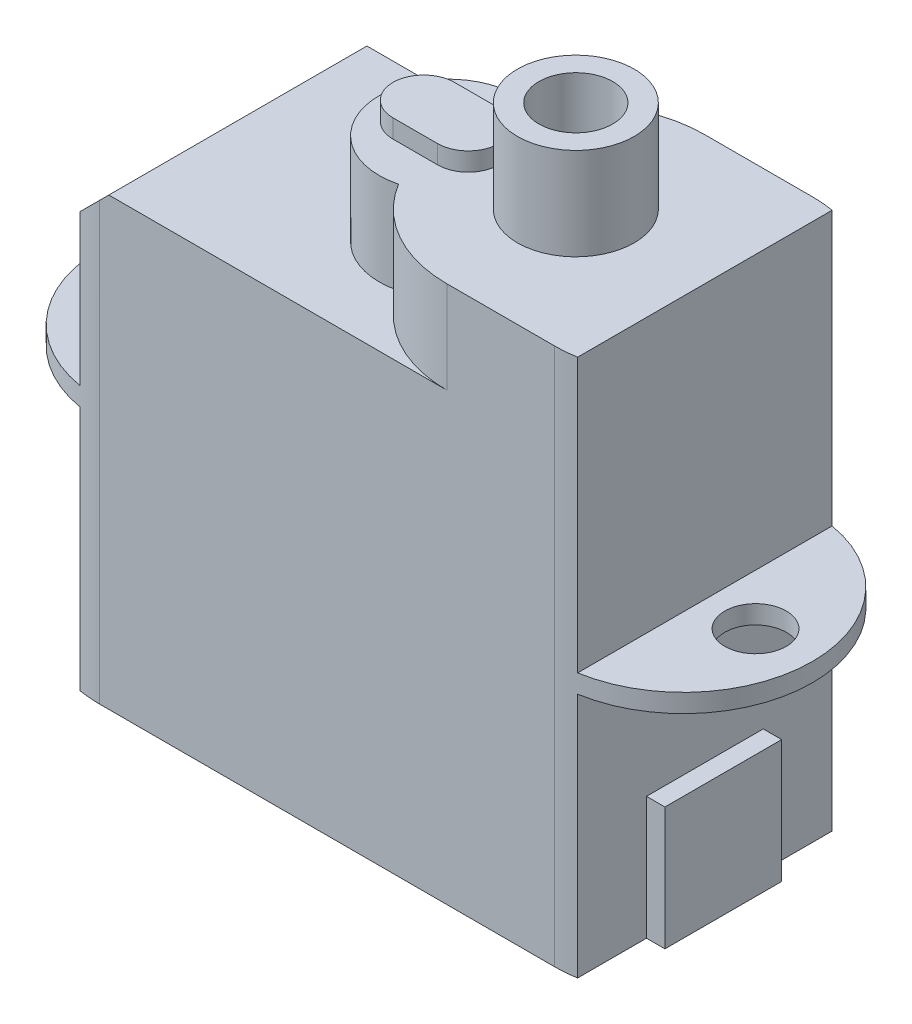
ISO-10303-21;
HEADER;
FILE_DESCRIPTION(('STEP AP214'),'2;1');
FILE_NAME('part.step','',(''),(''),'','','');
FILE_SCHEMA(('AUTOMOTIVE_DESIGN { 1 0 10303 214 1 1 1 1 }'));
ENDSEC;
DATA;
#1=APPLICATION_CONTEXT('core data for automotive mechanical design processes');
#2=APPLICATION_PROTOCOL_DEFINITION('international standard','automotive_design',2000,#1);
#3=PRODUCT_CONTEXT('',#1,'mechanical');
#4=PRODUCT('Part','Part','',(#3));
#5=PRODUCT_RELATED_PRODUCT_CATEGORY('part','',(#4));
#6=PRODUCT_DEFINITION_FORMATION('','',#4);
#7=PRODUCT_DEFINITION_CONTEXT('part definition',#1,'design');
#8=PRODUCT_DEFINITION('design','',#6,#7);
#9=PRODUCT_DEFINITION_SHAPE('','',#8);
#10=(LENGTH_UNIT() NAMED_UNIT(*) SI_UNIT(.MILLI.,.METRE.));
#11=(NAMED_UNIT(*) PLANE_ANGLE_UNIT() SI_UNIT($,.RADIAN.));
#12=(NAMED_UNIT(*) SI_UNIT($,.STERADIAN.) SOLID_ANGLE_UNIT());
#13=UNCERTAINTY_MEASURE_WITH_UNIT(LENGTH_MEASURE(1.E-05),#10,'distance_accuracy_value','');
#14=(GEOMETRIC_REPRESENTATION_CONTEXT(3) GLOBAL_UNCERTAINTY_ASSIGNED_CONTEXT((#13)) GLOBAL_UNIT_ASSIGNED_CONTEXT((#10,
#11,#12)) REPRESENTATION_CONTEXT('',''));
#15=CARTESIAN_POINT('',(0.,0.,0.));
#16=DIRECTION('',(0.,0.,1.));
#17=DIRECTION('',(1.,0.,0.));
#18=AXIS2_PLACEMENT_3D('',#15,#16,#17);
#19=CARTESIAN_POINT('',(8.1,14.5,4.2));
#20=DIRECTION('',(-1.,0.,0.));
#21=DIRECTION('',(0.,0.,1.));
#22=AXIS2_PLACEMENT_3D('',#19,#20,#21);
#23=PLANE('',#22);
#24=DIRECTION('',(0.,-1.,0.));
#25=VECTOR('',#24,1.);
#26=CARTESIAN_POINT('',(8.1,0.,1.9));
#27=LINE('',#26,#25);
#28=CARTESIAN_POINT('',(8.1,4.,1.9));
#29=VERTEX_POINT('',#28);
#30=CARTESIAN_POINT('',(8.1,0.,1.9));
#31=VERTEX_POINT('',#30);
#32=EDGE_CURVE('E272',#29,#31,#27,.T.);
#33=ORIENTED_EDGE('',*,*,#32,.F.);
#34=DIRECTION('',(0.,0.,1.));
#35=VECTOR('',#34,1.);
#36=CARTESIAN_POINT('',(8.1,4.,1.9));
#37=LINE('',#36,#35);
#38=CARTESIAN_POINT('',(8.1,4.,-1.9));
#39=VERTEX_POINT('',#38);
#40=EDGE_CURVE('E285',#39,#29,#37,.T.);
#41=ORIENTED_EDGE('',*,*,#40,.F.);
#42=DIRECTION('',(0.,1.,0.));
#43=VECTOR('',#42,1.);
#44=CARTESIAN_POINT('',(8.1,0.,-1.9));
#45=LINE('',#44,#43);
#46=CARTESIAN_POINT('',(8.1,0.,-1.9));
#47=VERTEX_POINT('',#46);
#48=EDGE_CURVE('E276',#47,#39,#45,.T.);
#49=ORIENTED_EDGE('',*,*,#48,.F.);
#50=DIRECTION('',(0.,0.,-1.));
#51=VECTOR('',#50,1.);
#52=CARTESIAN_POINT('',(8.1,0.,4.2));
#53=LINE('',#52,#51);
#54=CARTESIAN_POINT('',(8.1,0.,-4.14125584816973));
#55=VERTEX_POINT('',#54);
#56=EDGE_CURVE('E403',#47,#55,#53,.T.);
#57=ORIENTED_EDGE('',*,*,#56,.T.);
#58=DIRECTION('',(0.,-1.,0.));
#59=VECTOR('',#58,1.);
#60=CARTESIAN_POINT('',(8.1,7.4,-4.14125584816973));
#61=LINE('',#60,#59);
#62=CARTESIAN_POINT('',(8.1,8.,-4.14125584816973));
#63=VERTEX_POINT('',#62);
#64=EDGE_CURVE('E456',#55,#63,#61,.F.);
#65=ORIENTED_EDGE('',*,*,#64,.T.);
#66=DIRECTION('',(0.,0.,1.));
#67=VECTOR('',#66,1.);
#68=CARTESIAN_POINT('',(8.1,8.,4.2));
#69=LINE('',#68,#67);
#70=CARTESIAN_POINT('',(8.1,8.,4.14125584816973));
#71=VERTEX_POINT('',#70);
#72=EDGE_CURVE('E352',#63,#71,#69,.T.);
#73=ORIENTED_EDGE('',*,*,#72,.T.);
#74=DIRECTION('',(0.,-1.,0.));
#75=VECTOR('',#74,1.);
#76=CARTESIAN_POINT('',(8.1,7.4,4.14125584816973));
#77=LINE('',#76,#75);
#78=CARTESIAN_POINT('',(8.1,0.,4.14125584816973));
#79=VERTEX_POINT('',#78);
#80=EDGE_CURVE('E454',#71,#79,#77,.T.);
#81=ORIENTED_EDGE('',*,*,#80,.T.);
#82=EDGE_CURVE('E411',#79,#31,#53,.T.);
#83=ORIENTED_EDGE('',*,*,#82,.T.);
#84=EDGE_LOOP('',(#33,#41,#49,#57,#65,#73,#81,#83));
#85=FACE_BOUND('',#84,.T.);
#86=ADVANCED_FACE('F70',(#85),#23,.F.);
#87=CARTESIAN_POINT('',(3.9,17.5,0.));
#88=DIRECTION('',(0.,1.,0.));
#89=DIRECTION('',(0.,0.,1.));
#90=AXIS2_PLACEMENT_3D('',#87,#88,#89);
#91=PLANE('',#90);
#92=DIRECTION('',(-1.,0.,0.));
#93=VECTOR('',#92,1.);
#94=CARTESIAN_POINT('',(8.1,17.5,4.2));
#95=LINE('',#94,#93);
#96=CARTESIAN_POINT('',(7.4,17.5,4.2));
#97=VERTEX_POINT('',#96);
#98=CARTESIAN_POINT('',(3.9,17.5,4.2));
#99=VERTEX_POINT('',#98);
#100=EDGE_CURVE('E376',#97,#99,#95,.T.);
#101=ORIENTED_EDGE('',*,*,#100,.F.);
#102=CARTESIAN_POINT('',(7.4,17.5,0.));
#103=DIRECTION('',(0.,1.,0.));
#104=DIRECTION('',(0.,0.,1.));
#105=AXIS2_PLACEMENT_3D('',#102,#103,#104);
#106=CIRCLE('',#105,4.2);
#107=CARTESIAN_POINT('',(8.1,17.5,4.14125584816973));
#108=VERTEX_POINT('',#107);
#109=EDGE_CURVE('E431',#97,#108,#106,.T.);
#110=ORIENTED_EDGE('',*,*,#109,.T.);
#111=DIRECTION('',(0.,0.,1.));
#112=VECTOR('',#111,1.);
#113=CARTESIAN_POINT('',(8.1,17.5,-4.2));
#114=LINE('',#113,#112);
#115=CARTESIAN_POINT('',(8.1,17.5,-4.14125584816973));
#116=VERTEX_POINT('',#115);
#117=EDGE_CURVE('E378',#116,#108,#114,.T.);
#118=ORIENTED_EDGE('',*,*,#117,.F.);
#119=CARTESIAN_POINT('',(7.4,17.5,0.));
#120=DIRECTION('',(0.,1.,0.));
#121=DIRECTION('',(0.,0.,1.));
#122=AXIS2_PLACEMENT_3D('',#119,#120,#121);
#123=CIRCLE('',#122,4.2);
#124=CARTESIAN_POINT('',(7.4,17.5,-4.2));
#125=VERTEX_POINT('',#124);
#126=EDGE_CURVE('E428',#116,#125,#123,.T.);
#127=ORIENTED_EDGE('',*,*,#126,.T.);
#128=DIRECTION('',(1.,0.,0.));
#129=VECTOR('',#128,1.);
#130=CARTESIAN_POINT('',(3.9,17.5,-4.2));
#131=LINE('',#130,#129);
#132=CARTESIAN_POINT('',(3.9,17.5,-4.2));
#133=VERTEX_POINT('',#132);
#134=EDGE_CURVE('E381',#133,#125,#131,.T.);
#135=ORIENTED_EDGE('',*,*,#134,.F.);
#136=CARTESIAN_POINT('',(3.9,17.5,0.));
#137=DIRECTION('',(0.,1.,0.));
#138=DIRECTION('',(0.,0.,1.));
#139=AXIS2_PLACEMENT_3D('',#136,#137,#138);
#140=CIRCLE('',#139,4.2);
#141=CARTESIAN_POINT('',(0.309638554216869,17.5,-2.17928995056511));
#142=VERTEX_POINT('',#141);
#143=EDGE_CURVE('E367',#133,#142,#140,.T.);
#144=ORIENTED_EDGE('',*,*,#143,.T.);
#145=CARTESIAN_POINT('',(-0.249999999999997,17.5,0.));
#146=DIRECTION('',(0.,1.,0.));
#147=DIRECTION('',(0.,0.,1.));
#148=AXIS2_PLACEMENT_3D('',#145,#146,#147);
#149=CIRCLE('',#148,2.25);
#150=CARTESIAN_POINT('',(0.309638554216869,17.5,2.1792899505651));
#151=VERTEX_POINT('',#150);
#152=EDGE_CURVE('E370',#142,#151,#149,.T.);
#153=ORIENTED_EDGE('',*,*,#152,.T.);
#154=CARTESIAN_POINT('',(3.9,17.5,0.));
#155=DIRECTION('',(0.,1.,0.));
#156=DIRECTION('',(0.,0.,1.));
#157=AXIS2_PLACEMENT_3D('',#154,#155,#156);
#158=CIRCLE('',#157,4.2);
#159=EDGE_CURVE('E373',#151,#99,#158,.T.);
#160=ORIENTED_EDGE('',*,*,#159,.T.);
#161=EDGE_LOOP('',(#101,#110,#118,#127,#135,#144,#153,#160));
#162=FACE_BOUND('',#161,.T.);
#163=CARTESIAN_POINT('',(3.9,17.5,0.));
#164=DIRECTION('',(0.,1.,0.));
#165=DIRECTION('',(0.,0.,1.));
#166=AXIS2_PLACEMENT_3D('',#163,#164,#165);
#167=CIRCLE('',#166,1.9);
#168=CARTESIAN_POINT('',(3.9,17.5,1.9));
#169=VERTEX_POINT('',#168);
#170=EDGE_CURVE('E363',#169,#169,#167,.T.);
#171=ORIENTED_EDGE('',*,*,#170,.F.);
#172=EDGE_LOOP('',(#171));
#173=FACE_BOUND('',#172,.T.);
#174=DIRECTION('',(1.,0.,0.));
#175=VECTOR('',#174,1.);
#176=CARTESIAN_POINT('',(-1.05,17.5,1.));
#177=LINE('',#176,#175);
#178=CARTESIAN_POINT('',(-1.05,17.5,1.));
#179=VERTEX_POINT('',#178);
#180=CARTESIAN_POINT('',(0.400000000000003,17.5,1.));
#181=VERTEX_POINT('',#180);
#182=EDGE_CURVE('E321',#179,#181,#177,.T.);
#183=ORIENTED_EDGE('',*,*,#182,.F.);
#184=CARTESIAN_POINT('',(-1.05,17.5,0.));
#185=DIRECTION('',(0.,1.,0.));
#186=DIRECTION('',(0.,0.,1.));
#187=AXIS2_PLACEMENT_3D('',#184,#185,#186);
#188=CIRCLE('',#187,1.);
#189=CARTESIAN_POINT('',(-1.05,17.5,-1.));
#190=VERTEX_POINT('',#189);
#191=EDGE_CURVE('E307',#190,#179,#188,.T.);
#192=ORIENTED_EDGE('',*,*,#191,.F.);
#193=DIRECTION('',(-1.,0.,0.));
#194=VECTOR('',#193,1.);
#195=CARTESIAN_POINT('',(-1.05,17.5,-1.));
#196=LINE('',#195,#194);
#197=CARTESIAN_POINT('',(0.400000000000003,17.5,-1.));
#198=VERTEX_POINT('',#197);
#199=EDGE_CURVE('E312',#198,#190,#196,.T.);
#200=ORIENTED_EDGE('',*,*,#199,.F.);
#201=CARTESIAN_POINT('',(0.400000000000003,17.5,0.));
#202=DIRECTION('',(0.,1.,0.));
#203=DIRECTION('',(0.,0.,1.));
#204=AXIS2_PLACEMENT_3D('',#201,#202,#203);
#205=CIRCLE('',#204,1.);
#206=EDGE_CURVE('E323',#181,#198,#205,.T.);
#207=ORIENTED_EDGE('',*,*,#206,.F.);
#208=EDGE_LOOP('',(#183,#192,#200,#207));
#209=FACE_BOUND('',#208,.T.);
#210=ADVANCED_FACE('F526',(#162,#173,#209),#91,.T.);
#211=CARTESIAN_POINT('',(-7.4,9.2,0.));
#212=DIRECTION('',(0.,-1.,0.));
#213=DIRECTION('',(0.,0.,-1.));
#214=AXIS2_PLACEMENT_3D('',#211,#212,#213);
#215=CYLINDRICAL_SURFACE('',#214,4.2);
#216=DIRECTION('',(0.,-1.,0.));
#217=VECTOR('',#216,1.);
#218=CARTESIAN_POINT('',(-7.4,9.2,4.2));
#219=LINE('',#218,#217);
#220=CARTESIAN_POINT('',(-7.4,14.2,4.2));
#221=VERTEX_POINT('',#220);
#222=CARTESIAN_POINT('',(-7.4,9.2,4.2));
#223=VERTEX_POINT('',#222);
#224=EDGE_CURVE('E461',#221,#223,#219,.T.);
#225=ORIENTED_EDGE('',*,*,#224,.F.);
#226=CARTESIAN_POINT('',(-7.4,14.2,0.));
#227=DIRECTION('',(0.70710678118655,-0.707106781186545,0.));
#228=DIRECTION('',(-0.707106781186545,-0.70710678118655,0.));
#229=AXIS2_PLACEMENT_3D('',#226,#227,#228);
#230=ELLIPSE('',#229,5.93969696196702,4.2);
#231=CARTESIAN_POINT('',(-8.1,13.5,4.14125584816973));
#232=VERTEX_POINT('',#231);
#233=EDGE_CURVE('E500',#221,#232,#230,.T.);
#234=ORIENTED_EDGE('',*,*,#233,.T.);
#235=DIRECTION('',(0.,-1.,0.));
#236=VECTOR('',#235,1.);
#237=CARTESIAN_POINT('',(-8.1,9.2,4.14125584816973));
#238=LINE('',#237,#236);
#239=CARTESIAN_POINT('',(-8.1,8.6,4.14125584816973));
#240=VERTEX_POINT('',#239);
#241=EDGE_CURVE('E488',#240,#232,#238,.F.);
#242=ORIENTED_EDGE('',*,*,#241,.F.);
#243=CARTESIAN_POINT('',(-7.4,8.6,0.));
#244=DIRECTION('',(0.,1.,0.));
#245=DIRECTION('',(0.,0.,1.));
#246=AXIS2_PLACEMENT_3D('',#243,#244,#245);
#247=CIRCLE('',#246,4.2);
#248=CARTESIAN_POINT('',(-8.1,8.6,-4.14125584816973));
#249=VERTEX_POINT('',#248);
#250=EDGE_CURVE('E492',#249,#240,#247,.T.);
#251=ORIENTED_EDGE('',*,*,#250,.F.);
#252=DIRECTION('',(0.,-1.,0.));
#253=VECTOR('',#252,1.);
#254=CARTESIAN_POINT('',(-8.1,9.2,-4.14125584816973));
#255=LINE('',#254,#253);
#256=CARTESIAN_POINT('',(-8.1,13.5,-4.14125584816973));
#257=VERTEX_POINT('',#256);
#258=EDGE_CURVE('E490',#257,#249,#255,.T.);
#259=ORIENTED_EDGE('',*,*,#258,.F.);
#260=CARTESIAN_POINT('',(-7.4,14.2,0.));
#261=DIRECTION('',(0.70710678118655,-0.707106781186545,0.));
#262=DIRECTION('',(-0.707106781186545,-0.70710678118655,0.));
#263=AXIS2_PLACEMENT_3D('',#260,#261,#262);
#264=ELLIPSE('',#263,5.93969696196702,4.2);
#265=CARTESIAN_POINT('',(-7.4,14.2,-4.2));
#266=VERTEX_POINT('',#265);
#267=EDGE_CURVE('E86',#257,#266,#264,.T.);
#268=ORIENTED_EDGE('',*,*,#267,.T.);
#269=DIRECTION('',(0.,-1.,0.));
#270=VECTOR('',#269,1.);
#271=CARTESIAN_POINT('',(-7.4,9.2,-4.2));
#272=LINE('',#271,#270);
#273=CARTESIAN_POINT('',(-7.4,9.2,-4.2));
#274=VERTEX_POINT('',#273);
#275=EDGE_CURVE('E482',#274,#266,#272,.F.);
#276=ORIENTED_EDGE('',*,*,#275,.F.);
#277=DIRECTION('',(0.,-1.,0.));
#278=VECTOR('',#277,1.);
#279=CARTESIAN_POINT('',(-7.4,14.5,-4.2));
#280=LINE('',#279,#278);
#281=CARTESIAN_POINT('',(-7.4,7.4,-4.2));
#282=VERTEX_POINT('',#281);
#283=EDGE_CURVE('E484',#282,#274,#280,.F.);
#284=ORIENTED_EDGE('',*,*,#283,.F.);
#285=DIRECTION('',(0.,-1.,0.));
#286=VECTOR('',#285,1.);
#287=CARTESIAN_POINT('',(-7.4,9.2,-4.2));
#288=LINE('',#287,#286);
#289=CARTESIAN_POINT('',(-7.4,0.,-4.2));
#290=VERTEX_POINT('',#289);
#291=EDGE_CURVE('E486',#290,#282,#288,.F.);
#292=ORIENTED_EDGE('',*,*,#291,.F.);
#293=CARTESIAN_POINT('',(-7.4,0.,0.));
#294=DIRECTION('',(0.,-1.,0.));
#295=DIRECTION('',(0.,0.,-1.));
#296=AXIS2_PLACEMENT_3D('',#293,#294,#295);
#297=CIRCLE('',#296,4.2);
#298=CARTESIAN_POINT('',(-8.1,0.,-4.14125584816973));
#299=VERTEX_POINT('',#298);
#300=EDGE_CURVE('E469',#299,#290,#297,.T.);
#301=ORIENTED_EDGE('',*,*,#300,.F.);
#302=DIRECTION('',(0.,-1.,0.));
#303=VECTOR('',#302,1.);
#304=CARTESIAN_POINT('',(-8.1,9.2,-4.14125584816973));
#305=LINE('',#304,#303);
#306=CARTESIAN_POINT('',(-8.1,8.,-4.14125584816973));
#307=VERTEX_POINT('',#306);
#308=EDGE_CURVE('E475',#307,#299,#305,.T.);
#309=ORIENTED_EDGE('',*,*,#308,.F.);
#310=CARTESIAN_POINT('',(-7.4,8.,0.));
#311=DIRECTION('',(0.,1.,0.));
#312=DIRECTION('',(0.,0.,1.));
#313=AXIS2_PLACEMENT_3D('',#310,#311,#312);
#314=CIRCLE('',#313,4.2);
#315=CARTESIAN_POINT('',(-8.1,8.,4.14125584816973));
#316=VERTEX_POINT('',#315);
#317=EDGE_CURVE('E480',#316,#307,#314,.F.);
#318=ORIENTED_EDGE('',*,*,#317,.F.);
#319=DIRECTION('',(0.,-1.,0.));
#320=VECTOR('',#319,1.);
#321=CARTESIAN_POINT('',(-8.1,9.2,4.14125584816973));
#322=LINE('',#321,#320);
#323=CARTESIAN_POINT('',(-8.1,0.,4.14125584816973));
#324=VERTEX_POINT('',#323);
#325=EDGE_CURVE('E477',#324,#316,#322,.F.);
#326=ORIENTED_EDGE('',*,*,#325,.F.);
#327=CARTESIAN_POINT('',(-7.4,0.,0.));
#328=DIRECTION('',(0.,-1.,0.));
#329=DIRECTION('',(0.,0.,-1.));
#330=AXIS2_PLACEMENT_3D('',#327,#328,#329);
#331=CIRCLE('',#330,4.2);
#332=CARTESIAN_POINT('',(-7.4,0.,4.2));
#333=VERTEX_POINT('',#332);
#334=EDGE_CURVE('E472',#333,#324,#331,.T.);
#335=ORIENTED_EDGE('',*,*,#334,.F.);
#336=DIRECTION('',(0.,-1.,0.));
#337=VECTOR('',#336,1.);
#338=CARTESIAN_POINT('',(-7.4,9.2,4.2));
#339=LINE('',#338,#337);
#340=CARTESIAN_POINT('',(-7.4,7.4,4.2));
#341=VERTEX_POINT('',#340);
#342=EDGE_CURVE('E466',#341,#333,#339,.T.);
#343=ORIENTED_EDGE('',*,*,#342,.F.);
#344=DIRECTION('',(0.,-1.,0.));
#345=VECTOR('',#344,1.);
#346=CARTESIAN_POINT('',(-7.4,14.5,4.2));
#347=LINE('',#346,#345);
#348=EDGE_CURVE('E463',#223,#341,#347,.T.);
#349=ORIENTED_EDGE('',*,*,#348,.F.);
#350=EDGE_LOOP('',(#225,#234,#242,#251,#259,#268,#276,#284,#292,#301,#309,#318,#326,#335,#343,#349));
#351=FACE_BOUND('',#350,.T.);
#352=ADVANCED_FACE('F504',(#351),#215,.T.);
#353=CARTESIAN_POINT('',(7.4,7.4,0.));
#354=DIRECTION('',(0.,-1.,0.));
#355=DIRECTION('',(0.,0.,-1.));
#356=AXIS2_PLACEMENT_3D('',#353,#354,#355);
#357=CYLINDRICAL_SURFACE('',#356,4.2);
#358=DIRECTION('',(0.,-1.,0.));
#359=VECTOR('',#358,1.);
#360=CARTESIAN_POINT('',(7.4,7.4,4.2));
#361=LINE('',#360,#359);
#362=CARTESIAN_POINT('',(7.4,9.2,4.2));
#363=VERTEX_POINT('',#362);
#364=EDGE_CURVE('E425',#363,#97,#361,.F.);
#365=ORIENTED_EDGE('',*,*,#364,.F.);
#366=DIRECTION('',(0.,-1.,0.));
#367=VECTOR('',#366,1.);
#368=CARTESIAN_POINT('',(7.4,14.5,4.2));
#369=LINE('',#368,#367);
#370=CARTESIAN_POINT('',(7.4,7.4,4.2));
#371=VERTEX_POINT('',#370);
#372=EDGE_CURVE('E422',#371,#363,#369,.F.);
#373=ORIENTED_EDGE('',*,*,#372,.F.);
#374=DIRECTION('',(0.,-1.,0.));
#375=VECTOR('',#374,1.);
#376=CARTESIAN_POINT('',(7.4,7.4,4.2));
#377=LINE('',#376,#375);
#378=CARTESIAN_POINT('',(7.4,0.,4.2));
#379=VERTEX_POINT('',#378);
#380=EDGE_CURVE('E410',#379,#371,#377,.F.);
#381=ORIENTED_EDGE('',*,*,#380,.F.);
#382=CARTESIAN_POINT('',(7.4,0.,0.));
#383=DIRECTION('',(0.,-1.,0.));
#384=DIRECTION('',(0.,0.,-1.));
#385=AXIS2_PLACEMENT_3D('',#382,#383,#384);
#386=CIRCLE('',#385,4.2);
#387=EDGE_CURVE('E448',#79,#379,#386,.T.);
#388=ORIENTED_EDGE('',*,*,#387,.F.);
#389=ORIENTED_EDGE('',*,*,#80,.F.);
#390=CARTESIAN_POINT('',(7.4,8.,0.));
#391=DIRECTION('',(0.,-1.,0.));
#392=DIRECTION('',(0.,0.,-1.));
#393=AXIS2_PLACEMENT_3D('',#390,#391,#392);
#394=CIRCLE('',#393,4.2);
#395=EDGE_CURVE('E459',#63,#71,#394,.T.);
#396=ORIENTED_EDGE('',*,*,#395,.F.);
#397=ORIENTED_EDGE('',*,*,#64,.F.);
#398=CARTESIAN_POINT('',(7.4,0.,0.));
#399=DIRECTION('',(0.,-1.,0.));
#400=DIRECTION('',(0.,0.,-1.));
#401=AXIS2_PLACEMENT_3D('',#398,#399,#400);
#402=CIRCLE('',#401,4.2);
#403=CARTESIAN_POINT('',(7.4,0.,-4.2));
#404=VERTEX_POINT('',#403);
#405=EDGE_CURVE('E451',#404,#55,#402,.T.);
#406=ORIENTED_EDGE('',*,*,#405,.F.);
#407=DIRECTION('',(0.,-1.,0.));
#408=VECTOR('',#407,1.);
#409=CARTESIAN_POINT('',(7.4,7.4,-4.2));
#410=LINE('',#409,#408);
#411=CARTESIAN_POINT('',(7.4,7.4,-4.2));
#412=VERTEX_POINT('',#411);
#413=EDGE_CURVE('E441',#412,#404,#410,.T.);
#414=ORIENTED_EDGE('',*,*,#413,.F.);
#415=DIRECTION('',(0.,-1.,0.));
#416=VECTOR('',#415,1.);
#417=CARTESIAN_POINT('',(7.4,14.5,-4.2));
#418=LINE('',#417,#416);
#419=CARTESIAN_POINT('',(7.4,9.2,-4.2));
#420=VERTEX_POINT('',#419);
#421=EDGE_CURVE('E444',#420,#412,#418,.T.);
#422=ORIENTED_EDGE('',*,*,#421,.F.);
#423=DIRECTION('',(0.,-1.,0.));
#424=VECTOR('',#423,1.);
#425=CARTESIAN_POINT('',(7.4,7.4,-4.2));
#426=LINE('',#425,#424);
#427=EDGE_CURVE('E446',#125,#420,#426,.T.);
#428=ORIENTED_EDGE('',*,*,#427,.F.);
#429=ORIENTED_EDGE('',*,*,#126,.F.);
#430=DIRECTION('',(0.,-1.,0.));
#431=VECTOR('',#430,1.);
#432=CARTESIAN_POINT('',(8.1,7.4,-4.14125584816973));
#433=LINE('',#432,#431);
#434=CARTESIAN_POINT('',(8.1,8.6,-4.14125584816973));
#435=VERTEX_POINT('',#434);
#436=EDGE_CURVE('E434',#435,#116,#433,.F.);
#437=ORIENTED_EDGE('',*,*,#436,.F.);
#438=CARTESIAN_POINT('',(7.4,8.6,0.));
#439=DIRECTION('',(0.,-1.,0.));
#440=DIRECTION('',(0.,0.,-1.));
#441=AXIS2_PLACEMENT_3D('',#438,#439,#440);
#442=CIRCLE('',#441,4.2);
#443=CARTESIAN_POINT('',(8.1,8.6,4.14125584816973));
#444=VERTEX_POINT('',#443);
#445=EDGE_CURVE('E439',#444,#435,#442,.F.);
#446=ORIENTED_EDGE('',*,*,#445,.F.);
#447=DIRECTION('',(0.,-1.,0.));
#448=VECTOR('',#447,1.);
#449=CARTESIAN_POINT('',(8.1,7.4,4.14125584816973));
#450=LINE('',#449,#448);
#451=EDGE_CURVE('E436',#108,#444,#450,.T.);
#452=ORIENTED_EDGE('',*,*,#451,.F.);
#453=ORIENTED_EDGE('',*,*,#109,.F.);
#454=EDGE_LOOP('',(#365,#373,#381,#388,#389,#396,#397,#406,#414,#422,#428,#429,#437,#446,#452,#453));
#455=FACE_BOUND('',#454,.T.);
#456=ADVANCED_FACE('F532',(#455),#357,.T.);
#457=CARTESIAN_POINT('',(-8.1,14.5,4.2));
#458=DIRECTION('',(1.,0.,0.));
#459=DIRECTION('',(0.,0.,-1.));
#460=AXIS2_PLACEMENT_3D('',#457,#458,#459);
#461=PLANE('',#460);
#462=ORIENTED_EDGE('',*,*,#241,.T.);
#463=DIRECTION('',(0.,0.,-1.));
#464=VECTOR('',#463,1.);
#465=CARTESIAN_POINT('',(-8.1,13.5,4.2));
#466=LINE('',#465,#464);
#467=EDGE_CURVE('E79',#232,#257,#466,.T.);
#468=ORIENTED_EDGE('',*,*,#467,.T.);
#469=ORIENTED_EDGE('',*,*,#258,.T.);
#470=DIRECTION('',(0.,0.,-1.));
#471=VECTOR('',#470,1.);
#472=CARTESIAN_POINT('',(-8.1,8.6,4.2));
#473=LINE('',#472,#471);
#474=EDGE_CURVE('E343',#240,#249,#473,.T.);
#475=ORIENTED_EDGE('',*,*,#474,.F.);
#476=EDGE_LOOP('',(#462,#468,#469,#475));
#477=FACE_BOUND('',#476,.T.);
#478=ADVANCED_FACE('F509',(#477),#461,.F.);
#479=ORIENTED_EDGE('',*,*,#117,.T.);
#480=ORIENTED_EDGE('',*,*,#451,.T.);
#481=DIRECTION('',(0.,0.,1.));
#482=VECTOR('',#481,1.);
#483=CARTESIAN_POINT('',(8.1,8.6,4.2));
#484=LINE('',#483,#482);
#485=EDGE_CURVE('E355',#435,#444,#484,.T.);
#486=ORIENTED_EDGE('',*,*,#485,.F.);
#487=ORIENTED_EDGE('',*,*,#436,.T.);
#488=EDGE_LOOP('',(#479,#480,#486,#487));
#489=FACE_BOUND('',#488,.T.);
#490=ADVANCED_FACE('F569',(#489),#23,.F.);
#491=CARTESIAN_POINT('',(-8.1,14.5,-4.2));
#492=DIRECTION('',(0.,0.,1.));
#493=DIRECTION('',(1.,0.,0.));
#494=AXIS2_PLACEMENT_3D('',#491,#492,#493);
#495=PLANE('',#494);
#496=ORIENTED_EDGE('',*,*,#275,.T.);
#497=DIRECTION('',(-0.707106781186545,-0.70710678118655,0.));
#498=VECTOR('',#497,1.);
#499=CARTESIAN_POINT('',(-7.1,14.5,-4.2));
#500=LINE('',#499,#498);
#501=CARTESIAN_POINT('',(-7.1,14.5,-4.2));
#502=VERTEX_POINT('',#501);
#503=EDGE_CURVE('E14',#266,#502,#500,.F.);
#504=ORIENTED_EDGE('',*,*,#503,.T.);
#505=DIRECTION('',(-1.,0.,0.));
#506=VECTOR('',#505,1.);
#507=CARTESIAN_POINT('',(-8.1,14.5,-4.2));
#508=LINE('',#507,#506);
#509=CARTESIAN_POINT('',(3.9,14.5,-4.2));
#510=VERTEX_POINT('',#509);
#511=EDGE_CURVE('E404',#510,#502,#508,.T.);
#512=ORIENTED_EDGE('',*,*,#511,.F.);
#513=DIRECTION('',(0.,-1.,0.));
#514=VECTOR('',#513,1.);
#515=CARTESIAN_POINT('',(3.9,17.5,-4.2));
#516=LINE('',#515,#514);
#517=EDGE_CURVE('E384',#133,#510,#516,.T.);
#518=ORIENTED_EDGE('',*,*,#517,.F.);
#519=ORIENTED_EDGE('',*,*,#134,.T.);
#520=ORIENTED_EDGE('',*,*,#427,.T.);
#521=ORIENTED_EDGE('',*,*,#421,.T.);
#522=ORIENTED_EDGE('',*,*,#413,.T.);
#523=DIRECTION('',(-1.,0.,0.));
#524=VECTOR('',#523,1.);
#525=CARTESIAN_POINT('',(-8.1,0.,-4.2));
#526=LINE('',#525,#524);
#527=EDGE_CURVE('E413',#404,#290,#526,.T.);
#528=ORIENTED_EDGE('',*,*,#527,.T.);
#529=ORIENTED_EDGE('',*,*,#291,.T.);
#530=ORIENTED_EDGE('',*,*,#283,.T.);
#531=EDGE_LOOP('',(#496,#504,#512,#518,#519,#520,#521,#522,#528,#529,#530));
#532=FACE_BOUND('',#531,.T.);
#533=ADVANCED_FACE('F514',(#532),#495,.F.);
#534=DIRECTION('',(0.,0.,1.));
#535=VECTOR('',#534,1.);
#536=CARTESIAN_POINT('',(-8.1,0.,4.2));
#537=LINE('',#536,#535);
#538=EDGE_CURVE('E416',#299,#324,#537,.T.);
#539=ORIENTED_EDGE('',*,*,#538,.T.);
#540=ORIENTED_EDGE('',*,*,#325,.T.);
#541=DIRECTION('',(0.,0.,-1.));
#542=VECTOR('',#541,1.);
#543=CARTESIAN_POINT('',(-8.1,8.,4.2));
#544=LINE('',#543,#542);
#545=EDGE_CURVE('E340',#316,#307,#544,.T.);
#546=ORIENTED_EDGE('',*,*,#545,.T.);
#547=ORIENTED_EDGE('',*,*,#308,.T.);
#548=EDGE_LOOP('',(#539,#540,#546,#547));
#549=FACE_BOUND('',#548,.T.);
#550=ADVANCED_FACE('F545',(#549),#461,.F.);
#551=CARTESIAN_POINT('',(-8.1,14.5,4.2));
#552=DIRECTION('',(0.,0.,-1.));
#553=DIRECTION('',(-1.,0.,0.));
#554=AXIS2_PLACEMENT_3D('',#551,#552,#553);
#555=PLANE('',#554);
#556=DIRECTION('',(1.,0.,0.));
#557=VECTOR('',#556,1.);
#558=CARTESIAN_POINT('',(-8.1,14.5,4.2));
#559=LINE('',#558,#557);
#560=CARTESIAN_POINT('',(-7.1,14.5,4.2));
#561=VERTEX_POINT('',#560);
#562=CARTESIAN_POINT('',(3.9,14.5,4.2));
#563=VERTEX_POINT('',#562);
#564=EDGE_CURVE('E407',#561,#563,#559,.T.);
#565=ORIENTED_EDGE('',*,*,#564,.F.);
#566=DIRECTION('',(0.707106781186545,0.70710678118655,0.));
#567=VECTOR('',#566,1.);
#568=CARTESIAN_POINT('',(-7.1,14.5,4.2));
#569=LINE('',#568,#567);
#570=EDGE_CURVE('E497',#561,#221,#569,.F.);
#571=ORIENTED_EDGE('',*,*,#570,.T.);
#572=ORIENTED_EDGE('',*,*,#224,.T.);
#573=ORIENTED_EDGE('',*,*,#348,.T.);
#574=ORIENTED_EDGE('',*,*,#342,.T.);
#575=DIRECTION('',(1.,0.,0.));
#576=VECTOR('',#575,1.);
#577=CARTESIAN_POINT('',(-8.1,0.,4.2));
#578=LINE('',#577,#576);
#579=EDGE_CURVE('E408',#333,#379,#578,.T.);
#580=ORIENTED_EDGE('',*,*,#579,.T.);
#581=ORIENTED_EDGE('',*,*,#380,.T.);
#582=ORIENTED_EDGE('',*,*,#372,.T.);
#583=ORIENTED_EDGE('',*,*,#364,.T.);
#584=ORIENTED_EDGE('',*,*,#100,.T.);
#585=DIRECTION('',(0.,-1.,0.));
#586=VECTOR('',#585,1.);
#587=CARTESIAN_POINT('',(3.9,17.5,4.2));
#588=LINE('',#587,#586);
#589=EDGE_CURVE('E394',#99,#563,#588,.T.);
#590=ORIENTED_EDGE('',*,*,#589,.T.);
#591=EDGE_LOOP('',(#565,#571,#572,#573,#574,#580,#581,#582,#583,#584,#590));
#592=FACE_BOUND('',#591,.T.);
#593=ADVANCED_FACE('F589',(#592),#555,.F.);
#594=CARTESIAN_POINT('',(0.,14.5,0.));
#595=DIRECTION('',(0.,-1.,0.));
#596=DIRECTION('',(0.,0.,-1.));
#597=AXIS2_PLACEMENT_3D('',#594,#595,#596);
#598=PLANE('',#597);
#599=ORIENTED_EDGE('',*,*,#511,.T.);
#600=DIRECTION('',(0.,0.,1.));
#601=VECTOR('',#600,1.);
#602=CARTESIAN_POINT('',(-7.1,14.5,0.));
#603=LINE('',#602,#601);
#604=EDGE_CURVE('E494',#502,#561,#603,.T.);
#605=ORIENTED_EDGE('',*,*,#604,.T.);
#606=ORIENTED_EDGE('',*,*,#564,.T.);
#607=CARTESIAN_POINT('',(3.9,14.5,0.));
#608=DIRECTION('',(0.,1.,0.));
#609=DIRECTION('',(0.,0.,1.));
#610=AXIS2_PLACEMENT_3D('',#607,#608,#609);
#611=CIRCLE('',#610,4.2);
#612=CARTESIAN_POINT('',(0.309638554216869,14.5,2.1792899505651));
#613=VERTEX_POINT('',#612);
#614=EDGE_CURVE('E371',#613,#563,#611,.T.);
#615=ORIENTED_EDGE('',*,*,#614,.F.);
#616=CARTESIAN_POINT('',(-0.249999999999997,14.5,0.));
#617=DIRECTION('',(0.,1.,0.));
#618=DIRECTION('',(0.,0.,1.));
#619=AXIS2_PLACEMENT_3D('',#616,#617,#618);
#620=CIRCLE('',#619,2.25);
#621=CARTESIAN_POINT('',(0.309638554216869,14.5,-2.17928995056511));
#622=VERTEX_POINT('',#621);
#623=EDGE_CURVE('E387',#622,#613,#620,.T.);
#624=ORIENTED_EDGE('',*,*,#623,.F.);
#625=CARTESIAN_POINT('',(3.9,14.5,0.));
#626=DIRECTION('',(0.,1.,0.));
#627=DIRECTION('',(0.,0.,1.));
#628=AXIS2_PLACEMENT_3D('',#625,#626,#627);
#629=CIRCLE('',#628,4.2);
#630=EDGE_CURVE('E366',#510,#622,#629,.T.);
#631=ORIENTED_EDGE('',*,*,#630,.F.);
#632=EDGE_LOOP('',(#599,#605,#606,#615,#624,#631));
#633=FACE_BOUND('',#632,.T.);
#634=ADVANCED_FACE('F516',(#633),#598,.F.);
#635=CARTESIAN_POINT('',(0.,0.,0.));
#636=DIRECTION('',(0.,-1.,0.));
#637=DIRECTION('',(0.,0.,-1.));
#638=AXIS2_PLACEMENT_3D('',#635,#636,#637);
#639=PLANE('',#638);
#640=ORIENTED_EDGE('',*,*,#579,.F.);
#641=ORIENTED_EDGE('',*,*,#334,.T.);
#642=ORIENTED_EDGE('',*,*,#538,.F.);
#643=ORIENTED_EDGE('',*,*,#300,.T.);
#644=ORIENTED_EDGE('',*,*,#527,.F.);
#645=ORIENTED_EDGE('',*,*,#405,.T.);
#646=ORIENTED_EDGE('',*,*,#56,.F.);
#647=DIRECTION('',(-1.,0.,0.));
#648=VECTOR('',#647,1.);
#649=CARTESIAN_POINT('',(8.7,0.,-1.9));
#650=LINE('',#649,#648);
#651=CARTESIAN_POINT('',(8.7,0.,-1.9));
#652=VERTEX_POINT('',#651);
#653=EDGE_CURVE('E301',#652,#47,#650,.T.);
#654=ORIENTED_EDGE('',*,*,#653,.F.);
#655=DIRECTION('',(0.,0.,-1.));
#656=VECTOR('',#655,1.);
#657=CARTESIAN_POINT('',(8.7,0.,1.9));
#658=LINE('',#657,#656);
#659=CARTESIAN_POINT('',(8.7,0.,1.9));
#660=VERTEX_POINT('',#659);
#661=EDGE_CURVE('E284',#660,#652,#658,.T.);
#662=ORIENTED_EDGE('',*,*,#661,.F.);
#663=DIRECTION('',(-1.,0.,0.));
#664=VECTOR('',#663,1.);
#665=CARTESIAN_POINT('',(8.7,0.,1.9));
#666=LINE('',#665,#664);
#667=EDGE_CURVE('E304',#660,#31,#666,.T.);
#668=ORIENTED_EDGE('',*,*,#667,.T.);
#669=ORIENTED_EDGE('',*,*,#82,.F.);
#670=ORIENTED_EDGE('',*,*,#387,.T.);
#671=EDGE_LOOP('',(#640,#641,#642,#643,#644,#645,#646,#654,#662,#668,#669,#670));
#672=FACE_BOUND('',#671,.T.);
#673=ADVANCED_FACE('F538',(#672),#639,.T.);
#674=CARTESIAN_POINT('',(3.9,17.5,0.));
#675=DIRECTION('',(0.,-1.,0.));
#676=DIRECTION('',(0.,0.,-1.));
#677=AXIS2_PLACEMENT_3D('',#674,#675,#676);
#678=CYLINDRICAL_SURFACE('',#677,4.2);
#679=ORIENTED_EDGE('',*,*,#630,.T.);
#680=DIRECTION('',(0.,-1.,0.));
#681=VECTOR('',#680,1.);
#682=CARTESIAN_POINT('',(0.309638554216869,17.5,-2.17928995056511));
#683=LINE('',#682,#681);
#684=EDGE_CURVE('E400',#142,#622,#683,.T.);
#685=ORIENTED_EDGE('',*,*,#684,.F.);
#686=ORIENTED_EDGE('',*,*,#143,.F.);
#687=ORIENTED_EDGE('',*,*,#517,.T.);
#688=EDGE_LOOP('',(#679,#685,#686,#687));
#689=FACE_BOUND('',#688,.T.);
#690=ADVANCED_FACE('F520',(#689),#678,.T.);
#691=CARTESIAN_POINT('',(-0.249999999999997,17.5,0.));
#692=DIRECTION('',(0.,-1.,0.));
#693=DIRECTION('',(0.,0.,-1.));
#694=AXIS2_PLACEMENT_3D('',#691,#692,#693);
#695=CYLINDRICAL_SURFACE('',#694,2.25);
#696=ORIENTED_EDGE('',*,*,#623,.T.);
#697=DIRECTION('',(0.,-1.,0.));
#698=VECTOR('',#697,1.);
#699=CARTESIAN_POINT('',(0.309638554216869,17.5,2.1792899505651));
#700=LINE('',#699,#698);
#701=EDGE_CURVE('E397',#151,#613,#700,.T.);
#702=ORIENTED_EDGE('',*,*,#701,.F.);
#703=ORIENTED_EDGE('',*,*,#152,.F.);
#704=ORIENTED_EDGE('',*,*,#684,.T.);
#705=EDGE_LOOP('',(#696,#702,#703,#704));
#706=FACE_BOUND('',#705,.T.);
#707=ADVANCED_FACE('F625',(#706),#695,.T.);
#708=CARTESIAN_POINT('',(3.9,17.5,0.));
#709=DIRECTION('',(0.,-1.,0.));
#710=DIRECTION('',(0.,0.,-1.));
#711=AXIS2_PLACEMENT_3D('',#708,#709,#710);
#712=CYLINDRICAL_SURFACE('',#711,4.2);
#713=ORIENTED_EDGE('',*,*,#614,.T.);
#714=ORIENTED_EDGE('',*,*,#589,.F.);
#715=ORIENTED_EDGE('',*,*,#159,.F.);
#716=ORIENTED_EDGE('',*,*,#701,.T.);
#717=EDGE_LOOP('',(#713,#714,#715,#716));
#718=FACE_BOUND('',#717,.T.);
#719=ADVANCED_FACE('F620',(#718),#712,.T.);
#720=CARTESIAN_POINT('',(3.9,20.5,0.));
#721=DIRECTION('',(0.,-1.,0.));
#722=DIRECTION('',(0.,0.,-1.));
#723=AXIS2_PLACEMENT_3D('',#720,#721,#722);
#724=CYLINDRICAL_SURFACE('',#723,1.9);
#725=ORIENTED_EDGE('',*,*,#170,.T.);
#726=EDGE_LOOP('',(#725));
#727=FACE_BOUND('',#726,.T.);
#728=CARTESIAN_POINT('',(3.9,20.5,0.));
#729=DIRECTION('',(0.,1.,0.));
#730=DIRECTION('',(0.,0.,1.));
#731=AXIS2_PLACEMENT_3D('',#728,#729,#730);
#732=CIRCLE('',#731,1.9);
#733=CARTESIAN_POINT('',(3.9,20.5,1.9));
#734=VERTEX_POINT('',#733);
#735=EDGE_CURVE('E358',#734,#734,#732,.T.);
#736=ORIENTED_EDGE('',*,*,#735,.F.);
#737=EDGE_LOOP('',(#736));
#738=FACE_BOUND('',#737,.T.);
#739=ADVANCED_FACE('F617',(#727,#738),#724,.T.);
#740=CARTESIAN_POINT('',(0.,20.5,0.));
#741=DIRECTION('',(0.,1.,0.));
#742=DIRECTION('',(0.,0.,1.));
#743=AXIS2_PLACEMENT_3D('',#740,#741,#742);
#744=PLANE('',#743);
#745=CARTESIAN_POINT('',(3.9,20.5,0.));
#746=DIRECTION('',(0.,1.,0.));
#747=DIRECTION('',(0.,0.,1.));
#748=AXIS2_PLACEMENT_3D('',#745,#746,#747);
#749=CIRCLE('',#748,1.19999999999999);
#750=CARTESIAN_POINT('',(3.9,20.5,1.19999999999999));
#751=VERTEX_POINT('',#750);
#752=EDGE_CURVE('E273',#751,#751,#749,.T.);
#753=ORIENTED_EDGE('',*,*,#752,.F.);
#754=EDGE_LOOP('',(#753));
#755=FACE_BOUND('',#754,.T.);
#756=ORIENTED_EDGE('',*,*,#735,.T.);
#757=EDGE_LOOP('',(#756));
#758=FACE_BOUND('',#757,.T.);
#759=ADVANCED_FACE('F613',(#755,#758),#744,.T.);
#760=CARTESIAN_POINT('',(0.,8.6,0.));
#761=DIRECTION('',(0.,-1.,0.));
#762=DIRECTION('',(0.,0.,-1.));
#763=AXIS2_PLACEMENT_3D('',#760,#761,#762);
#764=PLANE('',#763);
#765=ORIENTED_EDGE('',*,*,#485,.T.);
#766=ORIENTED_EDGE('',*,*,#445,.T.);
#767=EDGE_LOOP('',(#765,#766));
#768=FACE_BOUND('',#767,.T.);
#769=CARTESIAN_POINT('',(9.75,8.6,0.));
#770=DIRECTION('',(0.,1.,0.));
#771=DIRECTION('',(0.,0.,1.));
#772=AXIS2_PLACEMENT_3D('',#769,#770,#771);
#773=CIRCLE('',#772,1.);
#774=CARTESIAN_POINT('',(9.75,8.6,1.));
#775=VERTEX_POINT('',#774);
#776=EDGE_CURVE('E349',#775,#775,#773,.T.);
#777=ORIENTED_EDGE('',*,*,#776,.F.);
#778=EDGE_LOOP('',(#777));
#779=FACE_BOUND('',#778,.T.);
#780=ADVANCED_FACE('F584',(#768,#779),#764,.F.);
#781=CARTESIAN_POINT('',(0.,8.,0.));
#782=DIRECTION('',(0.,-1.,0.));
#783=DIRECTION('',(0.,0.,-1.));
#784=AXIS2_PLACEMENT_3D('',#781,#782,#783);
#785=PLANE('',#784);
#786=ORIENTED_EDGE('',*,*,#72,.F.);
#787=ORIENTED_EDGE('',*,*,#395,.T.);
#788=EDGE_LOOP('',(#786,#787));
#789=FACE_BOUND('',#788,.T.);
#790=CARTESIAN_POINT('',(9.75,8.,0.));
#791=DIRECTION('',(0.,1.,0.));
#792=DIRECTION('',(0.,0.,1.));
#793=AXIS2_PLACEMENT_3D('',#790,#791,#792);
#794=CIRCLE('',#793,1.);
#795=CARTESIAN_POINT('',(9.75,8.,1.));
#796=VERTEX_POINT('',#795);
#797=EDGE_CURVE('E346',#796,#796,#794,.T.);
#798=ORIENTED_EDGE('',*,*,#797,.T.);
#799=EDGE_LOOP('',(#798));
#800=FACE_BOUND('',#799,.T.);
#801=ADVANCED_FACE('F597',(#789,#800),#785,.T.);
#802=CARTESIAN_POINT('',(9.75,8.6,0.));
#803=DIRECTION('',(0.,-1.,0.));
#804=DIRECTION('',(0.,0.,-1.));
#805=AXIS2_PLACEMENT_3D('',#802,#803,#804);
#806=CYLINDRICAL_SURFACE('',#805,1.);
#807=ORIENTED_EDGE('',*,*,#776,.T.);
#808=EDGE_LOOP('',(#807));
#809=FACE_BOUND('',#808,.T.);
#810=ORIENTED_EDGE('',*,*,#797,.F.);
#811=EDGE_LOOP('',(#810));
#812=FACE_BOUND('',#811,.T.);
#813=ADVANCED_FACE('F600',(#809,#812),#806,.F.);
#814=CARTESIAN_POINT('',(0.,8.6,0.));
#815=DIRECTION('',(0.,1.,0.));
#816=DIRECTION('',(0.,0.,1.));
#817=AXIS2_PLACEMENT_3D('',#814,#815,#816);
#818=PLANE('',#817);
#819=ORIENTED_EDGE('',*,*,#474,.T.);
#820=ORIENTED_EDGE('',*,*,#250,.T.);
#821=EDGE_LOOP('',(#819,#820));
#822=FACE_BOUND('',#821,.T.);
#823=CARTESIAN_POINT('',(-9.75,8.6,0.));
#824=DIRECTION('',(0.,1.,0.));
#825=DIRECTION('',(0.,0.,-1.));
#826=AXIS2_PLACEMENT_3D('',#823,#824,#825);
#827=CIRCLE('',#826,1.);
#828=CARTESIAN_POINT('',(-9.75,8.6,-1.));
#829=VERTEX_POINT('',#828);
#830=EDGE_CURVE('E337',#829,#829,#827,.T.);
#831=ORIENTED_EDGE('',*,*,#830,.F.);
#832=EDGE_LOOP('',(#831));
#833=FACE_BOUND('',#832,.T.);
#834=ADVANCED_FACE('F551',(#822,#833),#818,.T.);
#835=CARTESIAN_POINT('',(0.,8.,0.));
#836=DIRECTION('',(0.,1.,0.));
#837=DIRECTION('',(0.,0.,1.));
#838=AXIS2_PLACEMENT_3D('',#835,#836,#837);
#839=PLANE('',#838);
#840=ORIENTED_EDGE('',*,*,#545,.F.);
#841=ORIENTED_EDGE('',*,*,#317,.T.);
#842=EDGE_LOOP('',(#840,#841));
#843=FACE_BOUND('',#842,.T.);
#844=CARTESIAN_POINT('',(-9.75,8.,0.));
#845=DIRECTION('',(0.,1.,0.));
#846=DIRECTION('',(0.,0.,-1.));
#847=AXIS2_PLACEMENT_3D('',#844,#845,#846);
#848=CIRCLE('',#847,1.);
#849=CARTESIAN_POINT('',(-9.75,8.,-1.));
#850=VERTEX_POINT('',#849);
#851=EDGE_CURVE('E336',#850,#850,#848,.T.);
#852=ORIENTED_EDGE('',*,*,#851,.T.);
#853=EDGE_LOOP('',(#852));
#854=FACE_BOUND('',#853,.T.);
#855=ADVANCED_FACE('F547',(#843,#854),#839,.F.);
#856=CARTESIAN_POINT('',(-9.75,8.6,0.));
#857=DIRECTION('',(0.,-1.,0.));
#858=DIRECTION('',(0.,0.,-1.));
#859=AXIS2_PLACEMENT_3D('',#856,#857,#858);
#860=CYLINDRICAL_SURFACE('',#859,1.);
#861=ORIENTED_EDGE('',*,*,#830,.T.);
#862=EDGE_LOOP('',(#861));
#863=FACE_BOUND('',#862,.T.);
#864=ORIENTED_EDGE('',*,*,#851,.F.);
#865=EDGE_LOOP('',(#864));
#866=FACE_BOUND('',#865,.T.);
#867=ADVANCED_FACE('F550',(#863,#866),#860,.F.);
#868=CARTESIAN_POINT('',(-1.05,18.1,0.));
#869=DIRECTION('',(0.,-1.,0.));
#870=DIRECTION('',(0.,0.,-1.));
#871=AXIS2_PLACEMENT_3D('',#868,#869,#870);
#872=CYLINDRICAL_SURFACE('',#871,1.);
#873=ORIENTED_EDGE('',*,*,#191,.T.);
#874=DIRECTION('',(0.,-1.,0.));
#875=VECTOR('',#874,1.);
#876=CARTESIAN_POINT('',(-1.05,18.1,1.));
#877=LINE('',#876,#875);
#878=CARTESIAN_POINT('',(-1.05,18.1,1.));
#879=VERTEX_POINT('',#878);
#880=EDGE_CURVE('E334',#879,#179,#877,.T.);
#881=ORIENTED_EDGE('',*,*,#880,.F.);
#882=CARTESIAN_POINT('',(-1.05,18.1,0.));
#883=DIRECTION('',(0.,1.,0.));
#884=DIRECTION('',(0.,0.,1.));
#885=AXIS2_PLACEMENT_3D('',#882,#883,#884);
#886=CIRCLE('',#885,1.);
#887=CARTESIAN_POINT('',(-1.05,18.1,-1.));
#888=VERTEX_POINT('',#887);
#889=EDGE_CURVE('E308',#888,#879,#886,.T.);
#890=ORIENTED_EDGE('',*,*,#889,.F.);
#891=DIRECTION('',(0.,-1.,0.));
#892=VECTOR('',#891,1.);
#893=CARTESIAN_POINT('',(-1.05,18.1,-1.));
#894=LINE('',#893,#892);
#895=EDGE_CURVE('E318',#888,#190,#894,.T.);
#896=ORIENTED_EDGE('',*,*,#895,.T.);
#897=EDGE_LOOP('',(#873,#881,#890,#896));
#898=FACE_BOUND('',#897,.T.);
#899=ADVANCED_FACE('F556',(#898),#872,.T.);
#900=CARTESIAN_POINT('',(-1.05,18.1,1.));
#901=DIRECTION('',(0.,0.,-1.));
#902=DIRECTION('',(-1.,0.,0.));
#903=AXIS2_PLACEMENT_3D('',#900,#901,#902);
#904=PLANE('',#903);
#905=ORIENTED_EDGE('',*,*,#182,.T.);
#906=DIRECTION('',(0.,-1.,0.));
#907=VECTOR('',#906,1.);
#908=CARTESIAN_POINT('',(0.400000000000003,18.1,1.));
#909=LINE('',#908,#907);
#910=CARTESIAN_POINT('',(0.400000000000003,18.1,1.));
#911=VERTEX_POINT('',#910);
#912=EDGE_CURVE('E331',#911,#181,#909,.T.);
#913=ORIENTED_EDGE('',*,*,#912,.F.);
#914=DIRECTION('',(1.,0.,0.));
#915=VECTOR('',#914,1.);
#916=CARTESIAN_POINT('',(-1.05,18.1,1.));
#917=LINE('',#916,#915);
#918=EDGE_CURVE('E311',#879,#911,#917,.T.);
#919=ORIENTED_EDGE('',*,*,#918,.F.);
#920=ORIENTED_EDGE('',*,*,#880,.T.);
#921=EDGE_LOOP('',(#905,#913,#919,#920));
#922=FACE_BOUND('',#921,.T.);
#923=ADVANCED_FACE('F562',(#922),#904,.F.);
#924=CARTESIAN_POINT('',(0.400000000000003,18.1,0.));
#925=DIRECTION('',(0.,-1.,0.));
#926=DIRECTION('',(0.,0.,-1.));
#927=AXIS2_PLACEMENT_3D('',#924,#925,#926);
#928=CYLINDRICAL_SURFACE('',#927,1.);
#929=ORIENTED_EDGE('',*,*,#206,.T.);
#930=DIRECTION('',(0.,-1.,0.));
#931=VECTOR('',#930,1.);
#932=CARTESIAN_POINT('',(0.400000000000003,18.1,-1.));
#933=LINE('',#932,#931);
#934=CARTESIAN_POINT('',(0.400000000000003,18.1,-1.));
#935=VERTEX_POINT('',#934);
#936=EDGE_CURVE('E329',#935,#198,#933,.T.);
#937=ORIENTED_EDGE('',*,*,#936,.F.);
#938=CARTESIAN_POINT('',(0.400000000000003,18.1,0.));
#939=DIRECTION('',(0.,1.,0.));
#940=DIRECTION('',(0.,0.,1.));
#941=AXIS2_PLACEMENT_3D('',#938,#939,#940);
#942=CIRCLE('',#941,1.);
#943=EDGE_CURVE('E314',#911,#935,#942,.T.);
#944=ORIENTED_EDGE('',*,*,#943,.F.);
#945=ORIENTED_EDGE('',*,*,#912,.T.);
#946=EDGE_LOOP('',(#929,#937,#944,#945));
#947=FACE_BOUND('',#946,.T.);
#948=ADVANCED_FACE('F739',(#947),#928,.T.);
#949=CARTESIAN_POINT('',(-1.05,18.1,-1.));
#950=DIRECTION('',(0.,0.,1.));
#951=DIRECTION('',(1.,0.,0.));
#952=AXIS2_PLACEMENT_3D('',#949,#950,#951);
#953=PLANE('',#952);
#954=ORIENTED_EDGE('',*,*,#199,.T.);
#955=ORIENTED_EDGE('',*,*,#895,.F.);
#956=DIRECTION('',(-1.,0.,0.));
#957=VECTOR('',#956,1.);
#958=CARTESIAN_POINT('',(-1.05,18.1,-1.));
#959=LINE('',#958,#957);
#960=EDGE_CURVE('E316',#935,#888,#959,.T.);
#961=ORIENTED_EDGE('',*,*,#960,.F.);
#962=ORIENTED_EDGE('',*,*,#936,.T.);
#963=EDGE_LOOP('',(#954,#955,#961,#962));
#964=FACE_BOUND('',#963,.T.);
#965=ADVANCED_FACE('F748',(#964),#953,.F.);
#966=CARTESIAN_POINT('',(-1.05,18.1,0.));
#967=DIRECTION('',(0.,1.,0.));
#968=DIRECTION('',(0.,0.,1.));
#969=AXIS2_PLACEMENT_3D('',#966,#967,#968);
#970=PLANE('',#969);
#971=ORIENTED_EDGE('',*,*,#889,.T.);
#972=ORIENTED_EDGE('',*,*,#918,.T.);
#973=ORIENTED_EDGE('',*,*,#943,.T.);
#974=ORIENTED_EDGE('',*,*,#960,.T.);
#975=EDGE_LOOP('',(#971,#972,#973,#974));
#976=FACE_BOUND('',#975,.T.);
#977=ADVANCED_FACE('F757',(#976),#970,.T.);
#978=CARTESIAN_POINT('',(8.7,0.,1.9));
#979=DIRECTION('',(0.,0.,-1.));
#980=DIRECTION('',(0.,1.,0.));
#981=AXIS2_PLACEMENT_3D('',#978,#979,#980);
#982=PLANE('',#981);
#983=ORIENTED_EDGE('',*,*,#32,.T.);
#984=ORIENTED_EDGE('',*,*,#667,.F.);
#985=DIRECTION('',(0.,-1.,0.));
#986=VECTOR('',#985,1.);
#987=CARTESIAN_POINT('',(8.7,0.,1.9));
#988=LINE('',#987,#986);
#989=CARTESIAN_POINT('',(8.7,4.,1.9));
#990=VERTEX_POINT('',#989);
#991=EDGE_CURVE('E281',#990,#660,#988,.T.);
#992=ORIENTED_EDGE('',*,*,#991,.F.);
#993=DIRECTION('',(-1.,0.,0.));
#994=VECTOR('',#993,1.);
#995=CARTESIAN_POINT('',(8.7,4.,1.9));
#996=LINE('',#995,#994);
#997=EDGE_CURVE('E290',#990,#29,#996,.T.);
#998=ORIENTED_EDGE('',*,*,#997,.T.);
#999=EDGE_LOOP('',(#983,#984,#992,#998));
#1000=FACE_BOUND('',#999,.T.);
#1001=ADVANCED_FACE('F766',(#1000),#982,.F.);
#1002=CARTESIAN_POINT('',(8.7,0.,-1.9));
#1003=DIRECTION('',(0.,0.,1.));
#1004=DIRECTION('',(0.,-1.,0.));
#1005=AXIS2_PLACEMENT_3D('',#1002,#1003,#1004);
#1006=PLANE('',#1005);
#1007=ORIENTED_EDGE('',*,*,#48,.T.);
#1008=DIRECTION('',(-1.,0.,0.));
#1009=VECTOR('',#1008,1.);
#1010=CARTESIAN_POINT('',(8.7,4.,-1.9));
#1011=LINE('',#1010,#1009);
#1012=CARTESIAN_POINT('',(8.7,4.,-1.9));
#1013=VERTEX_POINT('',#1012);
#1014=EDGE_CURVE('E298',#1013,#39,#1011,.T.);
#1015=ORIENTED_EDGE('',*,*,#1014,.F.);
#1016=DIRECTION('',(0.,1.,0.));
#1017=VECTOR('',#1016,1.);
#1018=CARTESIAN_POINT('',(8.7,0.,-1.9));
#1019=LINE('',#1018,#1017);
#1020=EDGE_CURVE('E287',#652,#1013,#1019,.T.);
#1021=ORIENTED_EDGE('',*,*,#1020,.F.);
#1022=ORIENTED_EDGE('',*,*,#653,.T.);
#1023=EDGE_LOOP('',(#1007,#1015,#1021,#1022));
#1024=FACE_BOUND('',#1023,.T.);
#1025=ADVANCED_FACE('F787',(#1024),#1006,.F.);
#1026=CARTESIAN_POINT('',(8.7,4.,1.9));
#1027=DIRECTION('',(0.,-1.,0.));
#1028=DIRECTION('',(0.,0.,-1.));
#1029=AXIS2_PLACEMENT_3D('',#1026,#1027,#1028);
#1030=PLANE('',#1029);
#1031=ORIENTED_EDGE('',*,*,#40,.T.);
#1032=ORIENTED_EDGE('',*,*,#997,.F.);
#1033=DIRECTION('',(0.,0.,1.));
#1034=VECTOR('',#1033,1.);
#1035=CARTESIAN_POINT('',(8.7,4.,1.9));
#1036=LINE('',#1035,#1034);
#1037=EDGE_CURVE('E289',#1013,#990,#1036,.T.);
#1038=ORIENTED_EDGE('',*,*,#1037,.F.);
#1039=ORIENTED_EDGE('',*,*,#1014,.T.);
#1040=EDGE_LOOP('',(#1031,#1032,#1038,#1039));
#1041=FACE_BOUND('',#1040,.T.);
#1042=ADVANCED_FACE('F796',(#1041),#1030,.F.);
#1043=CARTESIAN_POINT('',(8.7,0.,0.));
#1044=DIRECTION('',(-1.,0.,0.));
#1045=DIRECTION('',(0.,0.,1.));
#1046=AXIS2_PLACEMENT_3D('',#1043,#1044,#1045);
#1047=PLANE('',#1046);
#1048=ORIENTED_EDGE('',*,*,#991,.T.);
#1049=ORIENTED_EDGE('',*,*,#661,.T.);
#1050=ORIENTED_EDGE('',*,*,#1020,.T.);
#1051=ORIENTED_EDGE('',*,*,#1037,.T.);
#1052=EDGE_LOOP('',(#1048,#1049,#1050,#1051));
#1053=FACE_BOUND('',#1052,.T.);
#1054=ADVANCED_FACE('F805',(#1053),#1047,.F.);
#1055=CARTESIAN_POINT('',(-7.1,14.5,0.));
#1056=DIRECTION('',(0.70710678118655,-0.707106781186545,0.));
#1057=DIRECTION('',(0.,0.,1.));
#1058=AXIS2_PLACEMENT_3D('',#1055,#1056,#1057);
#1059=PLANE('',#1058);
#1060=ORIENTED_EDGE('',*,*,#267,.F.);
#1061=ORIENTED_EDGE('',*,*,#467,.F.);
#1062=ORIENTED_EDGE('',*,*,#233,.F.);
#1063=ORIENTED_EDGE('',*,*,#570,.F.);
#1064=ORIENTED_EDGE('',*,*,#604,.F.);
#1065=ORIENTED_EDGE('',*,*,#503,.F.);
#1066=EDGE_LOOP('',(#1060,#1061,#1062,#1063,#1064,#1065));
#1067=FACE_BOUND('',#1066,.T.);
#1068=ADVANCED_FACE('F73',(#1067),#1059,.F.);
#1069=CARTESIAN_POINT('',(3.9,14.5,0.));
#1070=DIRECTION('',(0.,1.,0.));
#1071=DIRECTION('',(0.,0.,1.));
#1072=AXIS2_PLACEMENT_3D('',#1069,#1070,#1071);
#1073=CONICAL_SURFACE('',#1072,1.2,1.02974425867665);
#1074=CARTESIAN_POINT('',(3.9,13.7789672571669,0.));
#1075=VERTEX_POINT('',#1074);
#1076=VERTEX_LOOP('',#1075);
#1077=FACE_BOUND('',#1076,.T.);
#1078=CARTESIAN_POINT('',(3.9,14.5,0.));
#1079=DIRECTION('',(0.,1.,0.));
#1080=DIRECTION('',(0.,0.,1.));
#1081=AXIS2_PLACEMENT_3D('',#1078,#1079,#1080);
#1082=CIRCLE('',#1081,1.2);
#1083=CARTESIAN_POINT('',(3.9,14.5,1.2));
#1084=VERTEX_POINT('',#1083);
#1085=EDGE_CURVE('E270',#1084,#1084,#1082,.T.);
#1086=ORIENTED_EDGE('',*,*,#1085,.T.);
#1087=EDGE_LOOP('',(#1086));
#1088=FACE_BOUND('',#1087,.T.);
#1089=ADVANCED_FACE('F263',(#1077,#1088),#1073,.F.);
#1090=CARTESIAN_POINT('',(3.9,20.5,0.));
#1091=DIRECTION('',(0.,1.,0.));
#1092=DIRECTION('',(0.,0.,1.));
#1093=AXIS2_PLACEMENT_3D('',#1090,#1091,#1092);
#1094=CYLINDRICAL_SURFACE('',#1093,1.19999999999999);
#1095=ORIENTED_EDGE('',*,*,#1085,.F.);
#1096=EDGE_LOOP('',(#1095));
#1097=FACE_BOUND('',#1096,.T.);
#1098=ORIENTED_EDGE('',*,*,#752,.T.);
#1099=EDGE_LOOP('',(#1098));
#1100=FACE_BOUND('',#1099,.T.);
#1101=ADVANCED_FACE('F266',(#1097,#1100),#1094,.F.);
#1102=CLOSED_SHELL('',(#86,#210,#352,#456,#478,#490,#533,#550,#593,#634,#673,#690,#707,#719,
#739,#759,#780,#801,#813,#834,#855,#867,#899,#923,#948,#965,#977,#1001,#1025,#1042,#1054,#1068,
#1089,#1101));
#1103=MANIFOLD_SOLID_BREP('B2',#1102);
#1104=ADVANCED_BREP_SHAPE_REPRESENTATION('',(#18,#1103),#14);
#1105=SHAPE_DEFINITION_REPRESENTATION(#9,#1104);
ENDSEC;
END-ISO-10303-21;
